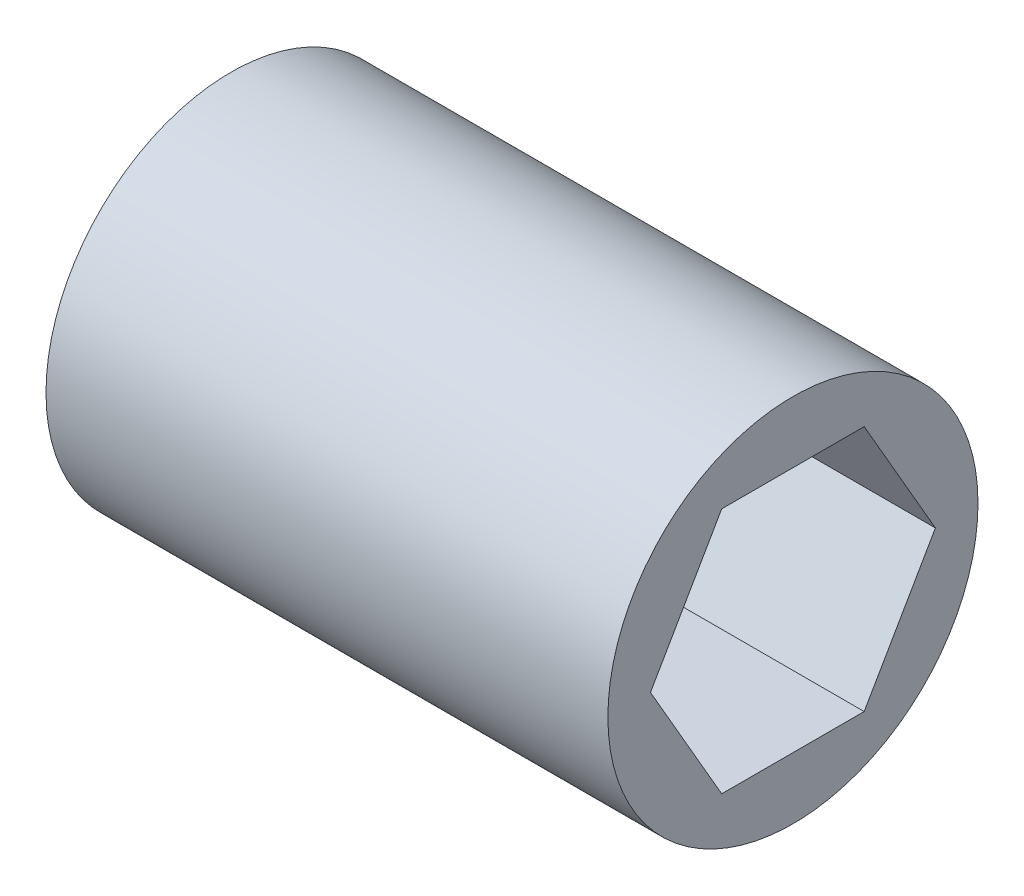
ISO-10303-21;
HEADER;
FILE_DESCRIPTION(('STEP AP214'),'2;1');
FILE_NAME('part.step','',(''),(''),'','','');
FILE_SCHEMA(('AUTOMOTIVE_DESIGN { 1 0 10303 214 1 1 1 1 }'));
ENDSEC;
DATA;
#1=APPLICATION_CONTEXT('core data for automotive mechanical design processes');
#2=APPLICATION_PROTOCOL_DEFINITION('international standard','automotive_design',2000,#1);
#3=PRODUCT_CONTEXT('',#1,'mechanical');
#4=PRODUCT('Part','Part','',(#3));
#5=PRODUCT_RELATED_PRODUCT_CATEGORY('part','',(#4));
#6=PRODUCT_DEFINITION_FORMATION('','',#4);
#7=PRODUCT_DEFINITION_CONTEXT('part definition',#1,'design');
#8=PRODUCT_DEFINITION('design','',#6,#7);
#9=PRODUCT_DEFINITION_SHAPE('','',#8);
#10=(LENGTH_UNIT() NAMED_UNIT(*) SI_UNIT(.MILLI.,.METRE.));
#11=(NAMED_UNIT(*) PLANE_ANGLE_UNIT() SI_UNIT($,.RADIAN.));
#12=(NAMED_UNIT(*) SI_UNIT($,.STERADIAN.) SOLID_ANGLE_UNIT());
#13=UNCERTAINTY_MEASURE_WITH_UNIT(LENGTH_MEASURE(1.E-05),#10,'distance_accuracy_value','');
#14=(GEOMETRIC_REPRESENTATION_CONTEXT(3) GLOBAL_UNCERTAINTY_ASSIGNED_CONTEXT((#13)) GLOBAL_UNIT_ASSIGNED_CONTEXT((#10,
#11,#12)) REPRESENTATION_CONTEXT('',''));
#15=CARTESIAN_POINT('',(0.,0.,0.));
#16=DIRECTION('',(0.,0.,1.));
#17=DIRECTION('',(1.,0.,0.));
#18=AXIS2_PLACEMENT_3D('',#15,#16,#17);
#19=CARTESIAN_POINT('',(14.46,0.,0.));
#20=DIRECTION('',(1.,0.,0.));
#21=DIRECTION('',(0.,0.,-1.));
#22=AXIS2_PLACEMENT_3D('',#19,#20,#21);
#23=PLANE('',#22);
#24=CARTESIAN_POINT('',(14.46,0.,0.));
#25=DIRECTION('',(1.,0.,0.));
#26=DIRECTION('',(0.,0.,-1.));
#27=AXIS2_PLACEMENT_3D('',#24,#25,#26);
#28=CIRCLE('',#27,9.52500000000001);
#29=CARTESIAN_POINT('',(14.46,0.,-9.52500000000001));
#30=VERTEX_POINT('',#29);
#31=EDGE_CURVE('E11',#30,#30,#28,.T.);
#32=ORIENTED_EDGE('',*,*,#31,.T.);
#33=EDGE_LOOP('',(#32));
#34=FACE_BOUND('',#33,.T.);
#35=DIRECTION('',(0.,0.866025403784441,0.499999999999996));
#36=VECTOR('',#35,1.);
#37=CARTESIAN_POINT('',(14.46,0.,-7.33234841870806));
#38=LINE('',#37,#36);
#39=CARTESIAN_POINT('',(14.46,0.,-7.33234841870806));
#40=VERTEX_POINT('',#39);
#41=CARTESIAN_POINT('',(14.46,6.35000000000008,-3.66617420935395));
#42=VERTEX_POINT('',#41);
#43=EDGE_CURVE('E96',#40,#42,#38,.T.);
#44=ORIENTED_EDGE('',*,*,#43,.F.);
#45=DIRECTION('',(0.,0.866025403784443,-0.499999999999992));
#46=VECTOR('',#45,1.);
#47=CARTESIAN_POINT('',(14.46,-6.34999999999999,-3.666174209354));
#48=LINE('',#47,#46);
#49=CARTESIAN_POINT('',(14.46,-6.34999999999999,-3.666174209354));
#50=VERTEX_POINT('',#49);
#51=EDGE_CURVE('E88',#50,#40,#48,.T.);
#52=ORIENTED_EDGE('',*,*,#51,.F.);
#53=DIRECTION('',(0.,0.,-1.));
#54=VECTOR('',#53,1.);
#55=CARTESIAN_POINT('',(14.46,-6.34999999999999,3.66617420935417));
#56=LINE('',#55,#54);
#57=CARTESIAN_POINT('',(14.46,-6.34999999999999,3.66617420935417));
#58=VERTEX_POINT('',#57);
#59=EDGE_CURVE('E116',#58,#50,#56,.T.);
#60=ORIENTED_EDGE('',*,*,#59,.F.);
#61=DIRECTION('',(0.,-0.866025403784438,-0.500000000000001));
#62=VECTOR('',#61,1.);
#63=CARTESIAN_POINT('',(14.46,0.,7.33234841870828));
#64=LINE('',#63,#62);
#65=CARTESIAN_POINT('',(14.46,0.,7.33234841870828));
#66=VERTEX_POINT('',#65);
#67=EDGE_CURVE('E114',#66,#58,#64,.T.);
#68=ORIENTED_EDGE('',*,*,#67,.F.);
#69=DIRECTION('',(0.,-0.86602540378444,0.499999999999998));
#70=VECTOR('',#69,1.);
#71=CARTESIAN_POINT('',(14.46,6.35000000000008,3.66617420935411));
#72=LINE('',#71,#70);
#73=CARTESIAN_POINT('',(14.46,6.35000000000008,3.66617420935411));
#74=VERTEX_POINT('',#73);
#75=EDGE_CURVE('E110',#74,#66,#72,.T.);
#76=ORIENTED_EDGE('',*,*,#75,.F.);
#77=DIRECTION('',(0.,0.,1.));
#78=VECTOR('',#77,1.);
#79=CARTESIAN_POINT('',(14.46,6.35000000000008,-3.66617420935395));
#80=LINE('',#79,#78);
#81=EDGE_CURVE('E108',#42,#74,#80,.T.);
#82=ORIENTED_EDGE('',*,*,#81,.F.);
#83=EDGE_LOOP('',(#44,#52,#60,#68,#76,#82));
#84=FACE_BOUND('',#83,.T.);
#85=ADVANCED_FACE('F35',(#34,#84),#23,.T.);
#86=CARTESIAN_POINT('',(-14.46,0.,0.));
#87=DIRECTION('',(1.,0.,0.));
#88=DIRECTION('',(0.,0.,-1.));
#89=AXIS2_PLACEMENT_3D('',#86,#87,#88);
#90=PLANE('',#89);
#91=CARTESIAN_POINT('',(-14.46,0.,0.));
#92=DIRECTION('',(1.,0.,0.));
#93=DIRECTION('',(0.,0.,-1.));
#94=AXIS2_PLACEMENT_3D('',#91,#92,#93);
#95=CIRCLE('',#94,9.52500000000001);
#96=CARTESIAN_POINT('',(-14.46,0.,-9.52500000000001));
#97=VERTEX_POINT('',#96);
#98=EDGE_CURVE('E39',#97,#97,#95,.T.);
#99=ORIENTED_EDGE('',*,*,#98,.F.);
#100=EDGE_LOOP('',(#99));
#101=FACE_BOUND('',#100,.T.);
#102=DIRECTION('',(0.,0.866025403784443,-0.499999999999992));
#103=VECTOR('',#102,1.);
#104=CARTESIAN_POINT('',(-14.46,-6.34999999999999,-3.666174209354));
#105=LINE('',#104,#103);
#106=CARTESIAN_POINT('',(-14.46,-6.34999999999999,-3.666174209354));
#107=VERTEX_POINT('',#106);
#108=CARTESIAN_POINT('',(-14.46,0.,-7.33234841870806));
#109=VERTEX_POINT('',#108);
#110=EDGE_CURVE('E58',#107,#109,#105,.T.);
#111=ORIENTED_EDGE('',*,*,#110,.T.);
#112=DIRECTION('',(0.,0.866025403784441,0.499999999999996));
#113=VECTOR('',#112,1.);
#114=CARTESIAN_POINT('',(-14.46,0.,-7.33234841870806));
#115=LINE('',#114,#113);
#116=CARTESIAN_POINT('',(-14.46,6.35000000000008,-3.66617420935395));
#117=VERTEX_POINT('',#116);
#118=EDGE_CURVE('E103',#109,#117,#115,.T.);
#119=ORIENTED_EDGE('',*,*,#118,.T.);
#120=DIRECTION('',(0.,0.,1.));
#121=VECTOR('',#120,1.);
#122=CARTESIAN_POINT('',(-14.46,6.35000000000008,-3.66617420935395));
#123=LINE('',#122,#121);
#124=CARTESIAN_POINT('',(-14.46,6.35000000000008,3.66617420935411));
#125=VERTEX_POINT('',#124);
#126=EDGE_CURVE('E120',#117,#125,#123,.T.);
#127=ORIENTED_EDGE('',*,*,#126,.T.);
#128=DIRECTION('',(0.,-0.86602540378444,0.499999999999998));
#129=VECTOR('',#128,1.);
#130=CARTESIAN_POINT('',(-14.46,6.35000000000008,3.66617420935411));
#131=LINE('',#130,#129);
#132=CARTESIAN_POINT('',(-14.46,0.,7.33234841870828));
#133=VERTEX_POINT('',#132);
#134=EDGE_CURVE('E123',#125,#133,#131,.T.);
#135=ORIENTED_EDGE('',*,*,#134,.T.);
#136=DIRECTION('',(0.,-0.866025403784438,-0.500000000000001));
#137=VECTOR('',#136,1.);
#138=CARTESIAN_POINT('',(-14.46,0.,7.33234841870828));
#139=LINE('',#138,#137);
#140=CARTESIAN_POINT('',(-14.46,-6.34999999999999,3.66617420935417));
#141=VERTEX_POINT('',#140);
#142=EDGE_CURVE('E126',#133,#141,#139,.T.);
#143=ORIENTED_EDGE('',*,*,#142,.T.);
#144=DIRECTION('',(0.,0.,-1.));
#145=VECTOR('',#144,1.);
#146=CARTESIAN_POINT('',(-14.46,-6.34999999999999,3.66617420935417));
#147=LINE('',#146,#145);
#148=EDGE_CURVE('E97',#141,#107,#147,.T.);
#149=ORIENTED_EDGE('',*,*,#148,.T.);
#150=EDGE_LOOP('',(#111,#119,#127,#135,#143,#149));
#151=FACE_BOUND('',#150,.T.);
#152=ADVANCED_FACE('F143',(#101,#151),#90,.F.);
#153=CARTESIAN_POINT('',(14.46,0.,0.));
#154=DIRECTION('',(-1.,0.,0.));
#155=DIRECTION('',(0.,0.,1.));
#156=AXIS2_PLACEMENT_3D('',#153,#154,#155);
#157=CYLINDRICAL_SURFACE('',#156,9.52500000000001);
#158=ORIENTED_EDGE('',*,*,#31,.F.);
#159=EDGE_LOOP('',(#158));
#160=FACE_BOUND('',#159,.T.);
#161=ORIENTED_EDGE('',*,*,#98,.T.);
#162=EDGE_LOOP('',(#161));
#163=FACE_BOUND('',#162,.T.);
#164=ADVANCED_FACE('F37',(#160,#163),#157,.T.);
#165=CARTESIAN_POINT('',(14.46,-6.34999999999999,-3.666174209354));
#166=DIRECTION('',(0.,0.499999999999992,0.866025403784443));
#167=DIRECTION('',(0.,-0.866025403784443,0.499999999999992));
#168=AXIS2_PLACEMENT_3D('',#165,#166,#167);
#169=PLANE('',#168);
#170=ORIENTED_EDGE('',*,*,#110,.F.);
#171=DIRECTION('',(-1.,0.,0.));
#172=VECTOR('',#171,1.);
#173=CARTESIAN_POINT('',(14.46,-6.34999999999999,-3.666174209354));
#174=LINE('',#173,#172);
#175=EDGE_CURVE('E92',#50,#107,#174,.T.);
#176=ORIENTED_EDGE('',*,*,#175,.F.);
#177=ORIENTED_EDGE('',*,*,#51,.T.);
#178=DIRECTION('',(-1.,0.,0.));
#179=VECTOR('',#178,1.);
#180=CARTESIAN_POINT('',(14.46,0.,-7.33234841870806));
#181=LINE('',#180,#179);
#182=EDGE_CURVE('E91',#40,#109,#181,.T.);
#183=ORIENTED_EDGE('',*,*,#182,.T.);
#184=EDGE_LOOP('',(#170,#176,#177,#183));
#185=FACE_BOUND('',#184,.T.);
#186=ADVANCED_FACE('F90',(#185),#169,.T.);
#187=CARTESIAN_POINT('',(14.46,0.,-7.33234841870806));
#188=DIRECTION('',(0.,-0.499999999999996,0.866025403784441));
#189=DIRECTION('',(0.,-0.866025403784441,-0.499999999999996));
#190=AXIS2_PLACEMENT_3D('',#187,#188,#189);
#191=PLANE('',#190);
#192=ORIENTED_EDGE('',*,*,#118,.F.);
#193=ORIENTED_EDGE('',*,*,#182,.F.);
#194=ORIENTED_EDGE('',*,*,#43,.T.);
#195=DIRECTION('',(-1.,0.,0.));
#196=VECTOR('',#195,1.);
#197=CARTESIAN_POINT('',(14.46,6.35000000000008,-3.66617420935395));
#198=LINE('',#197,#196);
#199=EDGE_CURVE('E104',#42,#117,#198,.T.);
#200=ORIENTED_EDGE('',*,*,#199,.T.);
#201=EDGE_LOOP('',(#192,#193,#194,#200));
#202=FACE_BOUND('',#201,.T.);
#203=ADVANCED_FACE('F100',(#202),#191,.T.);
#204=CARTESIAN_POINT('',(14.46,6.35000000000008,-3.66617420935395));
#205=DIRECTION('',(0.,-1.,0.));
#206=DIRECTION('',(0.,0.,-1.));
#207=AXIS2_PLACEMENT_3D('',#204,#205,#206);
#208=PLANE('',#207);
#209=ORIENTED_EDGE('',*,*,#126,.F.);
#210=ORIENTED_EDGE('',*,*,#199,.F.);
#211=ORIENTED_EDGE('',*,*,#81,.T.);
#212=DIRECTION('',(-1.,0.,0.));
#213=VECTOR('',#212,1.);
#214=CARTESIAN_POINT('',(14.46,6.35000000000008,3.66617420935411));
#215=LINE('',#214,#213);
#216=EDGE_CURVE('E135',#74,#125,#215,.T.);
#217=ORIENTED_EDGE('',*,*,#216,.T.);
#218=EDGE_LOOP('',(#209,#210,#211,#217));
#219=FACE_BOUND('',#218,.T.);
#220=ADVANCED_FACE('F139',(#219),#208,.T.);
#221=CARTESIAN_POINT('',(14.46,6.35000000000008,3.66617420935411));
#222=DIRECTION('',(0.,-0.499999999999998,-0.86602540378444));
#223=DIRECTION('',(0.,0.86602540378444,-0.499999999999998));
#224=AXIS2_PLACEMENT_3D('',#221,#222,#223);
#225=PLANE('',#224);
#226=ORIENTED_EDGE('',*,*,#134,.F.);
#227=ORIENTED_EDGE('',*,*,#216,.F.);
#228=ORIENTED_EDGE('',*,*,#75,.T.);
#229=DIRECTION('',(-1.,0.,0.));
#230=VECTOR('',#229,1.);
#231=CARTESIAN_POINT('',(14.46,0.,7.33234841870828));
#232=LINE('',#231,#230);
#233=EDGE_CURVE('E133',#66,#133,#232,.T.);
#234=ORIENTED_EDGE('',*,*,#233,.T.);
#235=EDGE_LOOP('',(#226,#227,#228,#234));
#236=FACE_BOUND('',#235,.T.);
#237=ADVANCED_FACE('F151',(#236),#225,.T.);
#238=CARTESIAN_POINT('',(14.46,0.,7.33234841870828));
#239=DIRECTION('',(0.,0.500000000000001,-0.866025403784438));
#240=DIRECTION('',(0.,0.866025403784438,0.500000000000001));
#241=AXIS2_PLACEMENT_3D('',#238,#239,#240);
#242=PLANE('',#241);
#243=ORIENTED_EDGE('',*,*,#142,.F.);
#244=ORIENTED_EDGE('',*,*,#233,.F.);
#245=ORIENTED_EDGE('',*,*,#67,.T.);
#246=DIRECTION('',(-1.,0.,0.));
#247=VECTOR('',#246,1.);
#248=CARTESIAN_POINT('',(14.46,-6.34999999999999,3.66617420935417));
#249=LINE('',#248,#247);
#250=EDGE_CURVE('E50',#58,#141,#249,.T.);
#251=ORIENTED_EDGE('',*,*,#250,.T.);
#252=EDGE_LOOP('',(#243,#244,#245,#251));
#253=FACE_BOUND('',#252,.T.);
#254=ADVANCED_FACE('F149',(#253),#242,.T.);
#255=CARTESIAN_POINT('',(14.46,-6.34999999999999,3.66617420935417));
#256=DIRECTION('',(0.,1.,0.));
#257=DIRECTION('',(0.,0.,1.));
#258=AXIS2_PLACEMENT_3D('',#255,#256,#257);
#259=PLANE('',#258);
#260=ORIENTED_EDGE('',*,*,#148,.F.);
#261=ORIENTED_EDGE('',*,*,#250,.F.);
#262=ORIENTED_EDGE('',*,*,#59,.T.);
#263=ORIENTED_EDGE('',*,*,#175,.T.);
#264=EDGE_LOOP('',(#260,#261,#262,#263));
#265=FACE_BOUND('',#264,.T.);
#266=ADVANCED_FACE('F145',(#265),#259,.T.);
#267=CLOSED_SHELL('',(#85,#152,#164,#186,#203,#220,#237,#254,#266));
#268=MANIFOLD_SOLID_BREP('B2',#267);
#269=ADVANCED_BREP_SHAPE_REPRESENTATION('',(#18,#268),#14);
#270=SHAPE_DEFINITION_REPRESENTATION(#9,#269);
ENDSEC;
END-ISO-10303-21;
